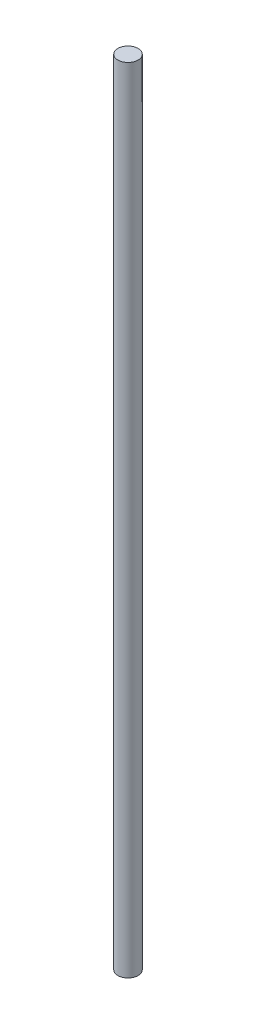
ISO-10303-21;
HEADER;
FILE_DESCRIPTION(('STEP AP214'),'2;1');
FILE_NAME('part.step','',(''),(''),'','','');
FILE_SCHEMA(('AUTOMOTIVE_DESIGN { 1 0 10303 214 1 1 1 1 }'));
ENDSEC;
DATA;
#1=APPLICATION_CONTEXT('core data for automotive mechanical design processes');
#2=APPLICATION_PROTOCOL_DEFINITION('international standard','automotive_design',2000,#1);
#3=PRODUCT_CONTEXT('',#1,'mechanical');
#4=PRODUCT('Part','Part','',(#3));
#5=PRODUCT_RELATED_PRODUCT_CATEGORY('part','',(#4));
#6=PRODUCT_DEFINITION_FORMATION('','',#4);
#7=PRODUCT_DEFINITION_CONTEXT('part definition',#1,'design');
#8=PRODUCT_DEFINITION('design','',#6,#7);
#9=PRODUCT_DEFINITION_SHAPE('','',#8);
#10=(LENGTH_UNIT() NAMED_UNIT(*) SI_UNIT(.MILLI.,.METRE.));
#11=(NAMED_UNIT(*) PLANE_ANGLE_UNIT() SI_UNIT($,.RADIAN.));
#12=(NAMED_UNIT(*) SI_UNIT($,.STERADIAN.) SOLID_ANGLE_UNIT());
#13=UNCERTAINTY_MEASURE_WITH_UNIT(LENGTH_MEASURE(1.E-05),#10,'distance_accuracy_value','');
#14=(GEOMETRIC_REPRESENTATION_CONTEXT(3) GLOBAL_UNCERTAINTY_ASSIGNED_CONTEXT((#13)) GLOBAL_UNIT_ASSIGNED_CONTEXT((#10,
#11,#12)) REPRESENTATION_CONTEXT('',''));
#15=CARTESIAN_POINT('',(0.,0.,0.));
#16=DIRECTION('',(0.,0.,1.));
#17=DIRECTION('',(1.,0.,0.));
#18=AXIS2_PLACEMENT_3D('',#15,#16,#17);
#19=CARTESIAN_POINT('',(0.,220.,0.));
#20=DIRECTION('',(0.,-1.,0.));
#21=DIRECTION('',(0.,0.,-1.));
#22=AXIS2_PLACEMENT_3D('',#19,#20,#21);
#23=CYLINDRICAL_SURFACE('',#22,2.8);
#24=CARTESIAN_POINT('',(0.,220.,0.));
#25=DIRECTION('',(0.,1.,0.));
#26=DIRECTION('',(0.,0.,1.));
#27=AXIS2_PLACEMENT_3D('',#24,#25,#26);
#28=CIRCLE('',#27,2.8);
#29=CARTESIAN_POINT('',(0.,220.,2.8));
#30=VERTEX_POINT('',#29);
#31=EDGE_CURVE('E10',#30,#30,#28,.T.);
#32=ORIENTED_EDGE('',*,*,#31,.F.);
#33=EDGE_LOOP('',(#32));
#34=FACE_BOUND('',#33,.T.);
#35=CARTESIAN_POINT('',(0.,0.,0.));
#36=DIRECTION('',(0.,1.,0.));
#37=DIRECTION('',(0.,0.,1.));
#38=AXIS2_PLACEMENT_3D('',#35,#36,#37);
#39=CIRCLE('',#38,2.8);
#40=CARTESIAN_POINT('',(0.,0.,2.8));
#41=VERTEX_POINT('',#40);
#42=EDGE_CURVE('E44',#41,#41,#39,.T.);
#43=ORIENTED_EDGE('',*,*,#42,.T.);
#44=EDGE_LOOP('',(#43));
#45=FACE_BOUND('',#44,.T.);
#46=ADVANCED_FACE('F41',(#34,#45),#23,.T.);
#47=CARTESIAN_POINT('',(0.,220.,0.));
#48=DIRECTION('',(0.,1.,0.));
#49=DIRECTION('',(0.,0.,1.));
#50=AXIS2_PLACEMENT_3D('',#47,#48,#49);
#51=PLANE('',#50);
#52=ORIENTED_EDGE('',*,*,#31,.T.);
#53=EDGE_LOOP('',(#52));
#54=FACE_BOUND('',#53,.T.);
#55=ADVANCED_FACE('F58',(#54),#51,.T.);
#56=CARTESIAN_POINT('',(0.,0.,0.));
#57=DIRECTION('',(0.,1.,0.));
#58=DIRECTION('',(0.,0.,1.));
#59=AXIS2_PLACEMENT_3D('',#56,#57,#58);
#60=PLANE('',#59);
#61=ORIENTED_EDGE('',*,*,#42,.F.);
#62=EDGE_LOOP('',(#61));
#63=FACE_BOUND('',#62,.T.);
#64=ADVANCED_FACE('F56',(#63),#60,.F.);
#65=CLOSED_SHELL('',(#46,#55,#64));
#66=MANIFOLD_SOLID_BREP('B2',#65);
#67=ADVANCED_BREP_SHAPE_REPRESENTATION('',(#18,#66),#14);
#68=SHAPE_DEFINITION_REPRESENTATION(#9,#67);
ENDSEC;
END-ISO-10303-21;
